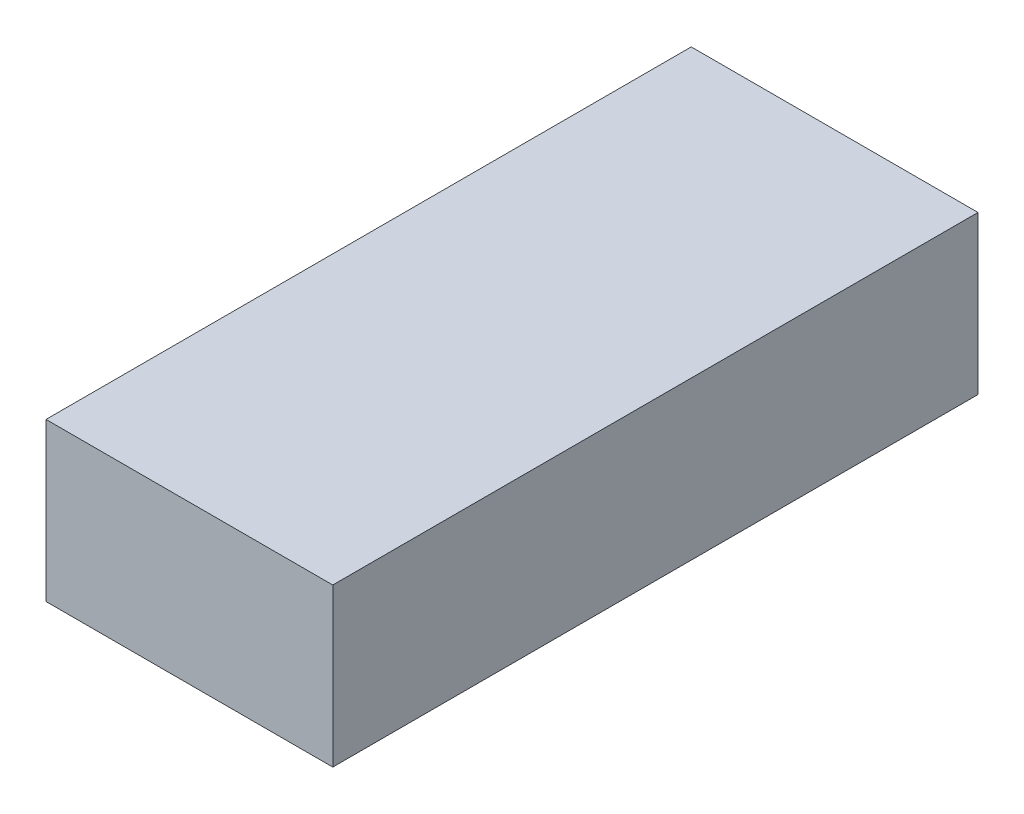
ISO-10303-21;
HEADER;
FILE_DESCRIPTION(('STEP AP214'),'2;1');
FILE_NAME('part.step','',(''),(''),'','','');
FILE_SCHEMA(('AUTOMOTIVE_DESIGN { 1 0 10303 214 1 1 1 1 }'));
ENDSEC;
DATA;
#1=APPLICATION_CONTEXT('core data for automotive mechanical design processes');
#2=APPLICATION_PROTOCOL_DEFINITION('international standard','automotive_design',2000,#1);
#3=PRODUCT_CONTEXT('',#1,'mechanical');
#4=PRODUCT('Part','Part','',(#3));
#5=PRODUCT_RELATED_PRODUCT_CATEGORY('part','',(#4));
#6=PRODUCT_DEFINITION_FORMATION('','',#4);
#7=PRODUCT_DEFINITION_CONTEXT('part definition',#1,'design');
#8=PRODUCT_DEFINITION('design','',#6,#7);
#9=PRODUCT_DEFINITION_SHAPE('','',#8);
#10=(LENGTH_UNIT() NAMED_UNIT(*) SI_UNIT(.MILLI.,.METRE.));
#11=(NAMED_UNIT(*) PLANE_ANGLE_UNIT() SI_UNIT($,.RADIAN.));
#12=(NAMED_UNIT(*) SI_UNIT($,.STERADIAN.) SOLID_ANGLE_UNIT());
#13=UNCERTAINTY_MEASURE_WITH_UNIT(LENGTH_MEASURE(1.E-05),#10,'distance_accuracy_value','');
#14=(GEOMETRIC_REPRESENTATION_CONTEXT(3) GLOBAL_UNCERTAINTY_ASSIGNED_CONTEXT((#13)) GLOBAL_UNIT_ASSIGNED_CONTEXT((#10,
#11,#12)) REPRESENTATION_CONTEXT('',''));
#15=CARTESIAN_POINT('',(0.,0.,0.));
#16=DIRECTION('',(0.,0.,1.));
#17=DIRECTION('',(1.,0.,0.));
#18=AXIS2_PLACEMENT_3D('',#15,#16,#17);
#19=CARTESIAN_POINT('',(0.,0.,45.));
#20=DIRECTION('',(1.,0.,0.));
#21=DIRECTION('',(0.,0.,-1.));
#22=AXIS2_PLACEMENT_3D('',#19,#20,#21);
#23=PLANE('',#22);
#24=DIRECTION('',(0.,-1.,0.));
#25=VECTOR('',#24,1.);
#26=CARTESIAN_POINT('',(0.,0.,0.));
#27=LINE('',#26,#25);
#28=CARTESIAN_POINT('',(0.,11.,0.));
#29=VERTEX_POINT('',#28);
#30=CARTESIAN_POINT('',(0.,0.,0.));
#31=VERTEX_POINT('',#30);
#32=EDGE_CURVE('E108',#29,#31,#27,.T.);
#33=ORIENTED_EDGE('',*,*,#32,.T.);
#34=DIRECTION('',(0.,0.,-1.));
#35=VECTOR('',#34,1.);
#36=CARTESIAN_POINT('',(0.,0.,45.));
#37=LINE('',#36,#35);
#38=CARTESIAN_POINT('',(0.,0.,45.));
#39=VERTEX_POINT('',#38);
#40=EDGE_CURVE('E11',#39,#31,#37,.T.);
#41=ORIENTED_EDGE('',*,*,#40,.F.);
#42=DIRECTION('',(0.,-1.,0.));
#43=VECTOR('',#42,1.);
#44=CARTESIAN_POINT('',(0.,0.,45.));
#45=LINE('',#44,#43);
#46=CARTESIAN_POINT('',(0.,11.,45.));
#47=VERTEX_POINT('',#46);
#48=EDGE_CURVE('E96',#47,#39,#45,.T.);
#49=ORIENTED_EDGE('',*,*,#48,.F.);
#50=DIRECTION('',(0.,0.,-1.));
#51=VECTOR('',#50,1.);
#52=CARTESIAN_POINT('',(0.,11.,45.));
#53=LINE('',#52,#51);
#54=EDGE_CURVE('E104',#47,#29,#53,.T.);
#55=ORIENTED_EDGE('',*,*,#54,.T.);
#56=EDGE_LOOP('',(#33,#41,#49,#55));
#57=FACE_BOUND('',#56,.T.);
#58=ADVANCED_FACE('F45',(#57),#23,.F.);
#59=CARTESIAN_POINT('',(0.,0.,45.));
#60=DIRECTION('',(0.,1.,0.));
#61=DIRECTION('',(0.,0.,1.));
#62=AXIS2_PLACEMENT_3D('',#59,#60,#61);
#63=PLANE('',#62);
#64=DIRECTION('',(1.,0.,0.));
#65=VECTOR('',#64,1.);
#66=CARTESIAN_POINT('',(0.,0.,0.));
#67=LINE('',#66,#65);
#68=CARTESIAN_POINT('',(20.,0.,0.));
#69=VERTEX_POINT('',#68);
#70=EDGE_CURVE('E100',#31,#69,#67,.T.);
#71=ORIENTED_EDGE('',*,*,#70,.T.);
#72=DIRECTION('',(0.,0.,-1.));
#73=VECTOR('',#72,1.);
#74=CARTESIAN_POINT('',(20.,0.,45.));
#75=LINE('',#74,#73);
#76=CARTESIAN_POINT('',(20.,0.,45.));
#77=VERTEX_POINT('',#76);
#78=EDGE_CURVE('E53',#77,#69,#75,.T.);
#79=ORIENTED_EDGE('',*,*,#78,.F.);
#80=DIRECTION('',(1.,0.,0.));
#81=VECTOR('',#80,1.);
#82=CARTESIAN_POINT('',(0.,0.,45.));
#83=LINE('',#82,#81);
#84=EDGE_CURVE('E91',#39,#77,#83,.T.);
#85=ORIENTED_EDGE('',*,*,#84,.F.);
#86=ORIENTED_EDGE('',*,*,#40,.T.);
#87=EDGE_LOOP('',(#71,#79,#85,#86));
#88=FACE_BOUND('',#87,.T.);
#89=ADVANCED_FACE('F99',(#88),#63,.F.);
#90=CARTESIAN_POINT('',(20.,0.,45.));
#91=DIRECTION('',(-1.,0.,0.));
#92=DIRECTION('',(0.,0.,1.));
#93=AXIS2_PLACEMENT_3D('',#90,#91,#92);
#94=PLANE('',#93);
#95=DIRECTION('',(0.,1.,0.));
#96=VECTOR('',#95,1.);
#97=CARTESIAN_POINT('',(20.,0.,0.));
#98=LINE('',#97,#96);
#99=CARTESIAN_POINT('',(20.,11.,0.));
#100=VERTEX_POINT('',#99);
#101=EDGE_CURVE('E78',#69,#100,#98,.T.);
#102=ORIENTED_EDGE('',*,*,#101,.T.);
#103=DIRECTION('',(0.,0.,-1.));
#104=VECTOR('',#103,1.);
#105=CARTESIAN_POINT('',(20.,11.,45.));
#106=LINE('',#105,#104);
#107=CARTESIAN_POINT('',(20.,11.,45.));
#108=VERTEX_POINT('',#107);
#109=EDGE_CURVE('E101',#108,#100,#106,.T.);
#110=ORIENTED_EDGE('',*,*,#109,.F.);
#111=DIRECTION('',(0.,1.,0.));
#112=VECTOR('',#111,1.);
#113=CARTESIAN_POINT('',(20.,0.,45.));
#114=LINE('',#113,#112);
#115=EDGE_CURVE('E94',#77,#108,#114,.T.);
#116=ORIENTED_EDGE('',*,*,#115,.F.);
#117=ORIENTED_EDGE('',*,*,#78,.T.);
#118=EDGE_LOOP('',(#102,#110,#116,#117));
#119=FACE_BOUND('',#118,.T.);
#120=ADVANCED_FACE('F102',(#119),#94,.F.);
#121=CARTESIAN_POINT('',(0.,11.,45.));
#122=DIRECTION('',(0.,-1.,0.));
#123=DIRECTION('',(0.,0.,-1.));
#124=AXIS2_PLACEMENT_3D('',#121,#122,#123);
#125=PLANE('',#124);
#126=DIRECTION('',(-1.,0.,0.));
#127=VECTOR('',#126,1.);
#128=CARTESIAN_POINT('',(0.,11.,0.));
#129=LINE('',#128,#127);
#130=EDGE_CURVE('E84',#100,#29,#129,.T.);
#131=ORIENTED_EDGE('',*,*,#130,.T.);
#132=ORIENTED_EDGE('',*,*,#54,.F.);
#133=DIRECTION('',(-1.,0.,0.));
#134=VECTOR('',#133,1.);
#135=CARTESIAN_POINT('',(0.,11.,45.));
#136=LINE('',#135,#134);
#137=EDGE_CURVE('E61',#108,#47,#136,.T.);
#138=ORIENTED_EDGE('',*,*,#137,.F.);
#139=ORIENTED_EDGE('',*,*,#109,.T.);
#140=EDGE_LOOP('',(#131,#132,#138,#139));
#141=FACE_BOUND('',#140,.T.);
#142=ADVANCED_FACE('F115',(#141),#125,.F.);
#143=CARTESIAN_POINT('',(0.,0.,45.));
#144=DIRECTION('',(0.,0.,-1.));
#145=DIRECTION('',(-1.,0.,0.));
#146=AXIS2_PLACEMENT_3D('',#143,#144,#145);
#147=PLANE('',#146);
#148=ORIENTED_EDGE('',*,*,#48,.T.);
#149=ORIENTED_EDGE('',*,*,#84,.T.);
#150=ORIENTED_EDGE('',*,*,#115,.T.);
#151=ORIENTED_EDGE('',*,*,#137,.T.);
#152=EDGE_LOOP('',(#148,#149,#150,#151));
#153=FACE_BOUND('',#152,.T.);
#154=ADVANCED_FACE('F92',(#153),#147,.F.);
#155=CARTESIAN_POINT('',(0.,0.,0.));
#156=DIRECTION('',(0.,0.,-1.));
#157=DIRECTION('',(-1.,0.,0.));
#158=AXIS2_PLACEMENT_3D('',#155,#156,#157);
#159=PLANE('',#158);
#160=ORIENTED_EDGE('',*,*,#32,.F.);
#161=ORIENTED_EDGE('',*,*,#130,.F.);
#162=ORIENTED_EDGE('',*,*,#101,.F.);
#163=ORIENTED_EDGE('',*,*,#70,.F.);
#164=EDGE_LOOP('',(#160,#161,#162,#163));
#165=FACE_BOUND('',#164,.T.);
#166=ADVANCED_FACE('F118',(#165),#159,.T.);
#167=CLOSED_SHELL('',(#58,#89,#120,#142,#154,#166));
#168=MANIFOLD_SOLID_BREP('B2',#167);
#169=ADVANCED_BREP_SHAPE_REPRESENTATION('',(#18,#168),#14);
#170=SHAPE_DEFINITION_REPRESENTATION(#9,#169);
ENDSEC;
END-ISO-10303-21;
